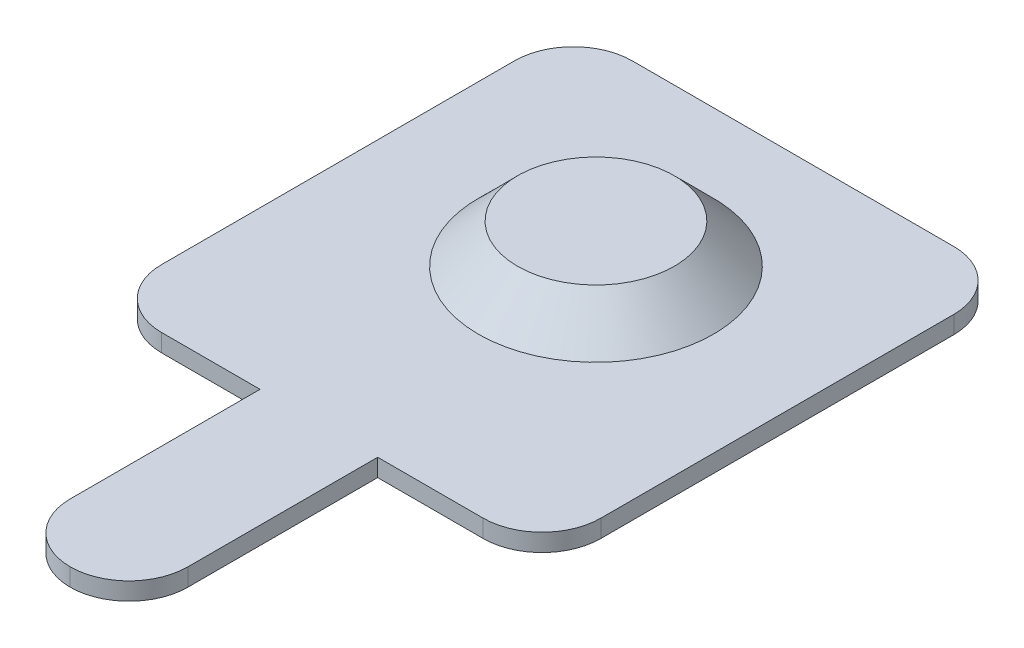
ISO-10303-21;
HEADER;
FILE_DESCRIPTION(('STEP AP214'),'2;1');
FILE_NAME('part.step','',(''),(''),'','','');
FILE_SCHEMA(('AUTOMOTIVE_DESIGN { 1 0 10303 214 1 1 1 1 }'));
ENDSEC;
DATA;
#1=APPLICATION_CONTEXT('core data for automotive mechanical design processes');
#2=APPLICATION_PROTOCOL_DEFINITION('international standard','automotive_design',2000,#1);
#3=PRODUCT_CONTEXT('',#1,'mechanical');
#4=PRODUCT('Part','Part','',(#3));
#5=PRODUCT_RELATED_PRODUCT_CATEGORY('part','',(#4));
#6=PRODUCT_DEFINITION_FORMATION('','',#4);
#7=PRODUCT_DEFINITION_CONTEXT('part definition',#1,'design');
#8=PRODUCT_DEFINITION('design','',#6,#7);
#9=PRODUCT_DEFINITION_SHAPE('','',#8);
#10=(LENGTH_UNIT() NAMED_UNIT(*) SI_UNIT(.MILLI.,.METRE.));
#11=(NAMED_UNIT(*) PLANE_ANGLE_UNIT() SI_UNIT($,.RADIAN.));
#12=(NAMED_UNIT(*) SI_UNIT($,.STERADIAN.) SOLID_ANGLE_UNIT());
#13=UNCERTAINTY_MEASURE_WITH_UNIT(LENGTH_MEASURE(1.E-05),#10,'distance_accuracy_value','');
#14=(GEOMETRIC_REPRESENTATION_CONTEXT(3) GLOBAL_UNCERTAINTY_ASSIGNED_CONTEXT((#13)) GLOBAL_UNIT_ASSIGNED_CONTEXT((#10,
#11,#12)) REPRESENTATION_CONTEXT('',''));
#15=CARTESIAN_POINT('',(0.,0.,0.));
#16=DIRECTION('',(0.,0.,1.));
#17=DIRECTION('',(1.,0.,0.));
#18=AXIS2_PLACEMENT_3D('',#15,#16,#17);
#19=CARTESIAN_POINT('',(0.,0.45,0.));
#20=DIRECTION('',(0.,1.,0.));
#21=DIRECTION('',(0.,0.,1.));
#22=AXIS2_PLACEMENT_3D('',#19,#20,#21);
#23=PLANE('',#22);
#24=CARTESIAN_POINT('',(5.57539399229632,0.45,-7.));
#25=DIRECTION('',(0.,1.,0.));
#26=DIRECTION('',(0.,0.,1.));
#27=AXIS2_PLACEMENT_3D('',#24,#25,#26);
#28=CIRCLE('',#27,3.);
#29=CARTESIAN_POINT('',(5.57539399229632,0.45,-4.));
#30=VERTEX_POINT('',#29);
#31=EDGE_CURVE('E11',#30,#30,#28,.F.);
#32=ORIENTED_EDGE('',*,*,#31,.T.);
#33=EDGE_LOOP('',(#32));
#34=FACE_BOUND('',#33,.T.);
#35=DIRECTION('',(0.,0.,-1.));
#36=VECTOR('',#35,1.);
#37=CARTESIAN_POINT('',(0.,0.45,0.));
#38=LINE('',#37,#36);
#39=CARTESIAN_POINT('',(0.,0.45,-1.5));
#40=VERTEX_POINT('',#39);
#41=CARTESIAN_POINT('',(0.,0.45,-10.5));
#42=VERTEX_POINT('',#41);
#43=EDGE_CURVE('E162',#40,#42,#38,.T.);
#44=ORIENTED_EDGE('',*,*,#43,.F.);
#45=CARTESIAN_POINT('',(1.5,0.45,-1.5));
#46=DIRECTION('',(0.,1.,0.));
#47=DIRECTION('',(0.,0.,1.));
#48=AXIS2_PLACEMENT_3D('',#45,#46,#47);
#49=CIRCLE('',#48,1.5);
#50=CARTESIAN_POINT('',(1.5,0.45,0.));
#51=VERTEX_POINT('',#50);
#52=EDGE_CURVE('E137',#40,#51,#49,.T.);
#53=ORIENTED_EDGE('',*,*,#52,.T.);
#54=DIRECTION('',(1.,0.,0.));
#55=VECTOR('',#54,1.);
#56=CARTESIAN_POINT('',(0.,0.45,0.));
#57=LINE('',#56,#55);
#58=CARTESIAN_POINT('',(4.0097451637429,0.45,0.));
#59=VERTEX_POINT('',#58);
#60=EDGE_CURVE('E131',#51,#59,#57,.T.);
#61=ORIENTED_EDGE('',*,*,#60,.T.);
#62=DIRECTION('',(0.,0.,1.));
#63=VECTOR('',#62,1.);
#64=CARTESIAN_POINT('',(4.0097451637429,0.45,0.));
#65=LINE('',#64,#63);
#66=CARTESIAN_POINT('',(4.0097451637429,0.45,4.84));
#67=VERTEX_POINT('',#66);
#68=EDGE_CURVE('E134',#59,#67,#65,.T.);
#69=ORIENTED_EDGE('',*,*,#68,.T.);
#70=CARTESIAN_POINT('',(5.5097451637429,0.45,4.84));
#71=DIRECTION('',(0.,1.,0.));
#72=DIRECTION('',(0.,0.,1.));
#73=AXIS2_PLACEMENT_3D('',#70,#71,#72);
#74=CIRCLE('',#73,1.5);
#75=CARTESIAN_POINT('',(5.5097451637429,0.45,6.34));
#76=VERTEX_POINT('',#75);
#77=EDGE_CURVE('E182',#67,#76,#74,.T.);
#78=ORIENTED_EDGE('',*,*,#77,.T.);
#79=CARTESIAN_POINT('',(5.5097451637429,0.45,4.84));
#80=DIRECTION('',(0.,1.,0.));
#81=DIRECTION('',(0.,0.,1.));
#82=AXIS2_PLACEMENT_3D('',#79,#80,#81);
#83=CIRCLE('',#82,1.5);
#84=CARTESIAN_POINT('',(7.0097451637429,0.45,4.84));
#85=VERTEX_POINT('',#84);
#86=EDGE_CURVE('E184',#76,#85,#83,.T.);
#87=ORIENTED_EDGE('',*,*,#86,.T.);
#88=DIRECTION('',(0.,0.,1.));
#89=VECTOR('',#88,1.);
#90=CARTESIAN_POINT('',(7.0097451637429,0.45,0.));
#91=LINE('',#90,#89);
#92=CARTESIAN_POINT('',(7.0097451637429,0.45,0.));
#93=VERTEX_POINT('',#92);
#94=EDGE_CURVE('E151',#93,#85,#91,.T.);
#95=ORIENTED_EDGE('',*,*,#94,.F.);
#96=CARTESIAN_POINT('',(9.7,0.45,0.));
#97=VERTEX_POINT('',#96);
#98=EDGE_CURVE('E144',#93,#97,#57,.T.);
#99=ORIENTED_EDGE('',*,*,#98,.T.);
#100=CARTESIAN_POINT('',(9.7,0.45,-1.5));
#101=DIRECTION('',(0.,1.,0.));
#102=DIRECTION('',(0.,0.,1.));
#103=AXIS2_PLACEMENT_3D('',#100,#101,#102);
#104=CIRCLE('',#103,1.5);
#105=CARTESIAN_POINT('',(11.2,0.45,-1.5));
#106=VERTEX_POINT('',#105);
#107=EDGE_CURVE('E186',#97,#106,#104,.T.);
#108=ORIENTED_EDGE('',*,*,#107,.T.);
#109=DIRECTION('',(0.,0.,-1.));
#110=VECTOR('',#109,1.);
#111=CARTESIAN_POINT('',(11.2,0.45,0.));
#112=LINE('',#111,#110);
#113=CARTESIAN_POINT('',(11.2,0.45,-10.5));
#114=VERTEX_POINT('',#113);
#115=EDGE_CURVE('E222',#106,#114,#112,.T.);
#116=ORIENTED_EDGE('',*,*,#115,.T.);
#117=CARTESIAN_POINT('',(9.7,0.45,-10.5));
#118=DIRECTION('',(0.,1.,0.));
#119=DIRECTION('',(0.,0.,1.));
#120=AXIS2_PLACEMENT_3D('',#117,#118,#119);
#121=CIRCLE('',#120,1.5);
#122=CARTESIAN_POINT('',(9.7,0.45,-12.));
#123=VERTEX_POINT('',#122);
#124=EDGE_CURVE('E50',#114,#123,#121,.T.);
#125=ORIENTED_EDGE('',*,*,#124,.T.);
#126=DIRECTION('',(1.,0.,0.));
#127=VECTOR('',#126,1.);
#128=CARTESIAN_POINT('',(0.,0.45,-12.));
#129=LINE('',#128,#127);
#130=CARTESIAN_POINT('',(1.5,0.45,-12.));
#131=VERTEX_POINT('',#130);
#132=EDGE_CURVE('E224',#131,#123,#129,.T.);
#133=ORIENTED_EDGE('',*,*,#132,.F.);
#134=CARTESIAN_POINT('',(1.5,0.45,-10.5));
#135=DIRECTION('',(0.,1.,0.));
#136=DIRECTION('',(0.,0.,1.));
#137=AXIS2_PLACEMENT_3D('',#134,#135,#136);
#138=CIRCLE('',#137,1.5);
#139=EDGE_CURVE('E189',#131,#42,#138,.T.);
#140=ORIENTED_EDGE('',*,*,#139,.T.);
#141=EDGE_LOOP('',(#44,#53,#61,#69,#78,#87,#95,#99,#108,#116,#125,#133,#140));
#142=FACE_BOUND('',#141,.T.);
#143=ADVANCED_FACE('F35',(#34,#142),#23,.T.);
#144=CARTESIAN_POINT('',(0.,0.45,0.));
#145=DIRECTION('',(0.,0.,-1.));
#146=DIRECTION('',(-1.,0.,0.));
#147=AXIS2_PLACEMENT_3D('',#144,#145,#146);
#148=PLANE('',#147);
#149=ORIENTED_EDGE('',*,*,#60,.F.);
#150=DIRECTION('',(0.,-1.,0.));
#151=VECTOR('',#150,1.);
#152=CARTESIAN_POINT('',(1.5,0.,0.));
#153=LINE('',#152,#151);
#154=CARTESIAN_POINT('',(1.5,0.,0.));
#155=VERTEX_POINT('',#154);
#156=EDGE_CURVE('E157',#51,#155,#153,.T.);
#157=ORIENTED_EDGE('',*,*,#156,.T.);
#158=DIRECTION('',(1.,0.,0.));
#159=VECTOR('',#158,1.);
#160=CARTESIAN_POINT('',(0.,0.,0.));
#161=LINE('',#160,#159);
#162=CARTESIAN_POINT('',(4.0097451637429,0.,0.));
#163=VERTEX_POINT('',#162);
#164=EDGE_CURVE('E155',#155,#163,#161,.T.);
#165=ORIENTED_EDGE('',*,*,#164,.T.);
#166=DIRECTION('',(0.,-1.,0.));
#167=VECTOR('',#166,1.);
#168=CARTESIAN_POINT('',(4.0097451637429,0.45,0.));
#169=LINE('',#168,#167);
#170=EDGE_CURVE('E149',#59,#163,#169,.T.);
#171=ORIENTED_EDGE('',*,*,#170,.F.);
#172=EDGE_LOOP('',(#149,#157,#165,#171));
#173=FACE_BOUND('',#172,.T.);
#174=ADVANCED_FACE('F153',(#173),#148,.F.);
#175=CARTESIAN_POINT('',(4.0097451637429,0.45,0.));
#176=DIRECTION('',(1.,0.,0.));
#177=DIRECTION('',(0.,0.,-1.));
#178=AXIS2_PLACEMENT_3D('',#175,#176,#177);
#179=PLANE('',#178);
#180=DIRECTION('',(0.,0.,1.));
#181=VECTOR('',#180,1.);
#182=CARTESIAN_POINT('',(4.0097451637429,0.,0.));
#183=LINE('',#182,#181);
#184=CARTESIAN_POINT('',(4.0097451637429,0.,4.84));
#185=VERTEX_POINT('',#184);
#186=EDGE_CURVE('E212',#163,#185,#183,.T.);
#187=ORIENTED_EDGE('',*,*,#186,.T.);
#188=DIRECTION('',(0.,-1.,0.));
#189=VECTOR('',#188,1.);
#190=CARTESIAN_POINT('',(4.0097451637429,0.45,4.84));
#191=LINE('',#190,#189);
#192=EDGE_CURVE('E43',#185,#67,#191,.F.);
#193=ORIENTED_EDGE('',*,*,#192,.T.);
#194=ORIENTED_EDGE('',*,*,#68,.F.);
#195=ORIENTED_EDGE('',*,*,#170,.T.);
#196=EDGE_LOOP('',(#187,#193,#194,#195));
#197=FACE_BOUND('',#196,.T.);
#198=ADVANCED_FACE('F148',(#197),#179,.F.);
#199=CARTESIAN_POINT('',(7.0097451637429,0.45,0.));
#200=DIRECTION('',(1.,0.,0.));
#201=DIRECTION('',(0.,0.,-1.));
#202=AXIS2_PLACEMENT_3D('',#199,#200,#201);
#203=PLANE('',#202);
#204=ORIENTED_EDGE('',*,*,#94,.T.);
#205=DIRECTION('',(0.,-1.,0.));
#206=VECTOR('',#205,1.);
#207=CARTESIAN_POINT('',(7.0097451637429,0.,4.84));
#208=LINE('',#207,#206);
#209=CARTESIAN_POINT('',(7.0097451637429,0.,4.84));
#210=VERTEX_POINT('',#209);
#211=EDGE_CURVE('E203',#85,#210,#208,.T.);
#212=ORIENTED_EDGE('',*,*,#211,.T.);
#213=DIRECTION('',(0.,0.,1.));
#214=VECTOR('',#213,1.);
#215=CARTESIAN_POINT('',(7.0097451637429,0.,0.));
#216=LINE('',#215,#214);
#217=CARTESIAN_POINT('',(7.0097451637429,0.,0.));
#218=VERTEX_POINT('',#217);
#219=EDGE_CURVE('E229',#218,#210,#216,.T.);
#220=ORIENTED_EDGE('',*,*,#219,.F.);
#221=DIRECTION('',(0.,-1.,0.));
#222=VECTOR('',#221,1.);
#223=CARTESIAN_POINT('',(7.0097451637429,0.45,0.));
#224=LINE('',#223,#222);
#225=EDGE_CURVE('E158',#93,#218,#224,.T.);
#226=ORIENTED_EDGE('',*,*,#225,.F.);
#227=EDGE_LOOP('',(#204,#212,#220,#226));
#228=FACE_BOUND('',#227,.T.);
#229=ADVANCED_FACE('F254',(#228),#203,.T.);
#230=CARTESIAN_POINT('',(9.7,0.,0.));
#231=VERTEX_POINT('',#230);
#232=EDGE_CURVE('E214',#218,#231,#161,.T.);
#233=ORIENTED_EDGE('',*,*,#232,.T.);
#234=DIRECTION('',(0.,-1.,0.));
#235=VECTOR('',#234,1.);
#236=CARTESIAN_POINT('',(9.7,0.45,0.));
#237=LINE('',#236,#235);
#238=EDGE_CURVE('E201',#231,#97,#237,.F.);
#239=ORIENTED_EDGE('',*,*,#238,.T.);
#240=ORIENTED_EDGE('',*,*,#98,.F.);
#241=ORIENTED_EDGE('',*,*,#225,.T.);
#242=EDGE_LOOP('',(#233,#239,#240,#241));
#243=FACE_BOUND('',#242,.T.);
#244=ADVANCED_FACE('F263',(#243),#148,.F.);
#245=CARTESIAN_POINT('',(11.2,0.45,0.));
#246=DIRECTION('',(-1.,0.,0.));
#247=DIRECTION('',(0.,0.,1.));
#248=AXIS2_PLACEMENT_3D('',#245,#246,#247);
#249=PLANE('',#248);
#250=DIRECTION('',(0.,0.,-1.));
#251=VECTOR('',#250,1.);
#252=CARTESIAN_POINT('',(11.2,0.,0.));
#253=LINE('',#252,#251);
#254=CARTESIAN_POINT('',(11.2,0.,-1.5));
#255=VERTEX_POINT('',#254);
#256=CARTESIAN_POINT('',(11.2,0.,-10.5));
#257=VERTEX_POINT('',#256);
#258=EDGE_CURVE('E232',#255,#257,#253,.T.);
#259=ORIENTED_EDGE('',*,*,#258,.T.);
#260=DIRECTION('',(0.,-1.,0.));
#261=VECTOR('',#260,1.);
#262=CARTESIAN_POINT('',(11.2,0.45,-10.5));
#263=LINE('',#262,#261);
#264=EDGE_CURVE('E199',#257,#114,#263,.F.);
#265=ORIENTED_EDGE('',*,*,#264,.T.);
#266=ORIENTED_EDGE('',*,*,#115,.F.);
#267=DIRECTION('',(0.,-1.,0.));
#268=VECTOR('',#267,1.);
#269=CARTESIAN_POINT('',(11.2,0.45,-1.5));
#270=LINE('',#269,#268);
#271=EDGE_CURVE('E196',#106,#255,#270,.T.);
#272=ORIENTED_EDGE('',*,*,#271,.T.);
#273=EDGE_LOOP('',(#259,#265,#266,#272));
#274=FACE_BOUND('',#273,.T.);
#275=ADVANCED_FACE('F270',(#274),#249,.F.);
#276=CARTESIAN_POINT('',(0.,0.45,-12.));
#277=DIRECTION('',(0.,0.,-1.));
#278=DIRECTION('',(-1.,0.,0.));
#279=AXIS2_PLACEMENT_3D('',#276,#277,#278);
#280=PLANE('',#279);
#281=DIRECTION('',(1.,0.,0.));
#282=VECTOR('',#281,1.);
#283=CARTESIAN_POINT('',(0.,0.,-12.));
#284=LINE('',#283,#282);
#285=CARTESIAN_POINT('',(1.5,0.,-12.));
#286=VERTEX_POINT('',#285);
#287=CARTESIAN_POINT('',(9.7,0.,-12.));
#288=VERTEX_POINT('',#287);
#289=EDGE_CURVE('E235',#286,#288,#284,.T.);
#290=ORIENTED_EDGE('',*,*,#289,.F.);
#291=DIRECTION('',(0.,-1.,0.));
#292=VECTOR('',#291,1.);
#293=CARTESIAN_POINT('',(1.5,0.45,-12.));
#294=LINE('',#293,#292);
#295=EDGE_CURVE('E57',#286,#131,#294,.F.);
#296=ORIENTED_EDGE('',*,*,#295,.T.);
#297=ORIENTED_EDGE('',*,*,#132,.T.);
#298=DIRECTION('',(0.,-1.,0.));
#299=VECTOR('',#298,1.);
#300=CARTESIAN_POINT('',(9.7,0.,-12.));
#301=LINE('',#300,#299);
#302=EDGE_CURVE('E192',#123,#288,#301,.T.);
#303=ORIENTED_EDGE('',*,*,#302,.T.);
#304=EDGE_LOOP('',(#290,#296,#297,#303));
#305=FACE_BOUND('',#304,.T.);
#306=ADVANCED_FACE('F275',(#305),#280,.T.);
#307=CARTESIAN_POINT('',(0.,0.45,0.));
#308=DIRECTION('',(-1.,0.,0.));
#309=DIRECTION('',(0.,0.,1.));
#310=AXIS2_PLACEMENT_3D('',#307,#308,#309);
#311=PLANE('',#310);
#312=DIRECTION('',(0.,0.,-1.));
#313=VECTOR('',#312,1.);
#314=CARTESIAN_POINT('',(0.,0.,0.));
#315=LINE('',#314,#313);
#316=CARTESIAN_POINT('',(0.,0.,-1.5));
#317=VERTEX_POINT('',#316);
#318=CARTESIAN_POINT('',(0.,0.,-10.5));
#319=VERTEX_POINT('',#318);
#320=EDGE_CURVE('E142',#317,#319,#315,.T.);
#321=ORIENTED_EDGE('',*,*,#320,.F.);
#322=DIRECTION('',(0.,-1.,0.));
#323=VECTOR('',#322,1.);
#324=CARTESIAN_POINT('',(0.,0.45,-1.5));
#325=LINE('',#324,#323);
#326=EDGE_CURVE('E180',#317,#40,#325,.F.);
#327=ORIENTED_EDGE('',*,*,#326,.T.);
#328=ORIENTED_EDGE('',*,*,#43,.T.);
#329=DIRECTION('',(0.,-1.,0.));
#330=VECTOR('',#329,1.);
#331=CARTESIAN_POINT('',(0.,0.45,-10.5));
#332=LINE('',#331,#330);
#333=EDGE_CURVE('E177',#42,#319,#332,.T.);
#334=ORIENTED_EDGE('',*,*,#333,.T.);
#335=EDGE_LOOP('',(#321,#327,#328,#334));
#336=FACE_BOUND('',#335,.T.);
#337=ADVANCED_FACE('F243',(#336),#311,.T.);
#338=CARTESIAN_POINT('',(0.,0.,0.));
#339=DIRECTION('',(0.,1.,0.));
#340=DIRECTION('',(0.,0.,1.));
#341=AXIS2_PLACEMENT_3D('',#338,#339,#340);
#342=PLANE('',#341);
#343=ORIENTED_EDGE('',*,*,#164,.F.);
#344=CARTESIAN_POINT('',(1.5,0.,-1.5));
#345=DIRECTION('',(0.,1.,0.));
#346=DIRECTION('',(0.,0.,1.));
#347=AXIS2_PLACEMENT_3D('',#344,#345,#346);
#348=CIRCLE('',#347,1.5);
#349=EDGE_CURVE('E175',#155,#317,#348,.F.);
#350=ORIENTED_EDGE('',*,*,#349,.T.);
#351=ORIENTED_EDGE('',*,*,#320,.T.);
#352=CARTESIAN_POINT('',(1.5,0.,-10.5));
#353=DIRECTION('',(0.,1.,0.));
#354=DIRECTION('',(0.,0.,1.));
#355=AXIS2_PLACEMENT_3D('',#352,#353,#354);
#356=CIRCLE('',#355,1.5);
#357=EDGE_CURVE('E173',#319,#286,#356,.F.);
#358=ORIENTED_EDGE('',*,*,#357,.T.);
#359=ORIENTED_EDGE('',*,*,#289,.T.);
#360=CARTESIAN_POINT('',(9.7,0.,-10.5));
#361=DIRECTION('',(0.,1.,0.));
#362=DIRECTION('',(0.,0.,1.));
#363=AXIS2_PLACEMENT_3D('',#360,#361,#362);
#364=CIRCLE('',#363,1.5);
#365=EDGE_CURVE('E171',#288,#257,#364,.F.);
#366=ORIENTED_EDGE('',*,*,#365,.T.);
#367=ORIENTED_EDGE('',*,*,#258,.F.);
#368=CARTESIAN_POINT('',(9.7,0.,-1.5));
#369=DIRECTION('',(0.,1.,0.));
#370=DIRECTION('',(0.,0.,1.));
#371=AXIS2_PLACEMENT_3D('',#368,#369,#370);
#372=CIRCLE('',#371,1.5);
#373=EDGE_CURVE('E169',#255,#231,#372,.F.);
#374=ORIENTED_EDGE('',*,*,#373,.T.);
#375=ORIENTED_EDGE('',*,*,#232,.F.);
#376=ORIENTED_EDGE('',*,*,#219,.T.);
#377=CARTESIAN_POINT('',(5.5097451637429,0.,4.84));
#378=DIRECTION('',(0.,1.,0.));
#379=DIRECTION('',(0.,0.,1.));
#380=AXIS2_PLACEMENT_3D('',#377,#378,#379);
#381=CIRCLE('',#380,1.5);
#382=CARTESIAN_POINT('',(5.5097451637429,0.,6.34));
#383=VERTEX_POINT('',#382);
#384=EDGE_CURVE('E167',#210,#383,#381,.F.);
#385=ORIENTED_EDGE('',*,*,#384,.T.);
#386=CARTESIAN_POINT('',(5.5097451637429,0.,4.84));
#387=DIRECTION('',(0.,1.,0.));
#388=DIRECTION('',(0.,0.,1.));
#389=AXIS2_PLACEMENT_3D('',#386,#387,#388);
#390=CIRCLE('',#389,1.5);
#391=EDGE_CURVE('E160',#383,#185,#390,.F.);
#392=ORIENTED_EDGE('',*,*,#391,.T.);
#393=ORIENTED_EDGE('',*,*,#186,.F.);
#394=EDGE_LOOP('',(#343,#350,#351,#358,#359,#366,#367,#374,#375,#376,#385,#392,#393));
#395=FACE_BOUND('',#394,.T.);
#396=ADVANCED_FACE('F240',(#395),#342,.F.);
#397=CARTESIAN_POINT('',(1.5,0.45,-1.5));
#398=DIRECTION('',(0.,1.,0.));
#399=DIRECTION('',(0.,0.,1.));
#400=AXIS2_PLACEMENT_3D('',#397,#398,#399);
#401=CYLINDRICAL_SURFACE('',#400,1.5);
#402=ORIENTED_EDGE('',*,*,#52,.F.);
#403=ORIENTED_EDGE('',*,*,#326,.F.);
#404=ORIENTED_EDGE('',*,*,#349,.F.);
#405=ORIENTED_EDGE('',*,*,#156,.F.);
#406=EDGE_LOOP('',(#402,#403,#404,#405));
#407=FACE_BOUND('',#406,.T.);
#408=ADVANCED_FACE('F246',(#407),#401,.T.);
#409=CARTESIAN_POINT('',(1.5,0.45,-10.5));
#410=DIRECTION('',(0.,-1.,0.));
#411=DIRECTION('',(0.,0.,-1.));
#412=AXIS2_PLACEMENT_3D('',#409,#410,#411);
#413=CYLINDRICAL_SURFACE('',#412,1.5);
#414=ORIENTED_EDGE('',*,*,#139,.F.);
#415=ORIENTED_EDGE('',*,*,#295,.F.);
#416=ORIENTED_EDGE('',*,*,#357,.F.);
#417=ORIENTED_EDGE('',*,*,#333,.F.);
#418=EDGE_LOOP('',(#414,#415,#416,#417));
#419=FACE_BOUND('',#418,.T.);
#420=ADVANCED_FACE('F278',(#419),#413,.T.);
#421=CARTESIAN_POINT('',(9.7,0.45,-10.5));
#422=DIRECTION('',(0.,1.,0.));
#423=DIRECTION('',(0.,0.,1.));
#424=AXIS2_PLACEMENT_3D('',#421,#422,#423);
#425=CYLINDRICAL_SURFACE('',#424,1.5);
#426=ORIENTED_EDGE('',*,*,#124,.F.);
#427=ORIENTED_EDGE('',*,*,#264,.F.);
#428=ORIENTED_EDGE('',*,*,#365,.F.);
#429=ORIENTED_EDGE('',*,*,#302,.F.);
#430=EDGE_LOOP('',(#426,#427,#428,#429));
#431=FACE_BOUND('',#430,.T.);
#432=ADVANCED_FACE('F273',(#431),#425,.T.);
#433=CARTESIAN_POINT('',(9.7,0.45,-1.5));
#434=DIRECTION('',(0.,-1.,0.));
#435=DIRECTION('',(0.,0.,-1.));
#436=AXIS2_PLACEMENT_3D('',#433,#434,#435);
#437=CYLINDRICAL_SURFACE('',#436,1.5);
#438=ORIENTED_EDGE('',*,*,#107,.F.);
#439=ORIENTED_EDGE('',*,*,#238,.F.);
#440=ORIENTED_EDGE('',*,*,#373,.F.);
#441=ORIENTED_EDGE('',*,*,#271,.F.);
#442=EDGE_LOOP('',(#438,#439,#440,#441));
#443=FACE_BOUND('',#442,.T.);
#444=ADVANCED_FACE('F266',(#443),#437,.T.);
#445=CARTESIAN_POINT('',(5.5097451637429,0.45,4.84));
#446=DIRECTION('',(0.,-1.,0.));
#447=DIRECTION('',(0.,0.,-1.));
#448=AXIS2_PLACEMENT_3D('',#445,#446,#447);
#449=CYLINDRICAL_SURFACE('',#448,1.5);
#450=DIRECTION('',(0.,-1.,0.));
#451=VECTOR('',#450,1.);
#452=CARTESIAN_POINT('',(5.5097451637429,0.45,6.34));
#453=LINE('',#452,#451);
#454=EDGE_CURVE('E206',#76,#383,#453,.T.);
#455=ORIENTED_EDGE('',*,*,#454,.F.);
#456=ORIENTED_EDGE('',*,*,#77,.F.);
#457=ORIENTED_EDGE('',*,*,#192,.F.);
#458=ORIENTED_EDGE('',*,*,#391,.F.);
#459=EDGE_LOOP('',(#455,#456,#457,#458));
#460=FACE_BOUND('',#459,.T.);
#461=ADVANCED_FACE('F249',(#460),#449,.T.);
#462=CARTESIAN_POINT('',(5.5097451637429,0.45,4.84));
#463=DIRECTION('',(0.,1.,0.));
#464=DIRECTION('',(0.,0.,1.));
#465=AXIS2_PLACEMENT_3D('',#462,#463,#464);
#466=CYLINDRICAL_SURFACE('',#465,1.5);
#467=ORIENTED_EDGE('',*,*,#86,.F.);
#468=ORIENTED_EDGE('',*,*,#454,.T.);
#469=ORIENTED_EDGE('',*,*,#384,.F.);
#470=ORIENTED_EDGE('',*,*,#211,.F.);
#471=EDGE_LOOP('',(#467,#468,#469,#470));
#472=FACE_BOUND('',#471,.T.);
#473=ADVANCED_FACE('F257',(#472),#466,.T.);
#474=CARTESIAN_POINT('',(5.57539399229632,1.45,-7.));
#475=DIRECTION('',(0.,1.,0.));
#476=DIRECTION('',(0.,0.,1.));
#477=AXIS2_PLACEMENT_3D('',#474,#475,#476);
#478=PLANE('',#477);
#479=CARTESIAN_POINT('',(5.57539399229632,1.45,-7.));
#480=DIRECTION('',(0.,1.,0.));
#481=DIRECTION('',(0.,0.,1.));
#482=AXIS2_PLACEMENT_3D('',#479,#480,#481);
#483=CIRCLE('',#482,2.);
#484=CARTESIAN_POINT('',(5.57539399229632,1.45,-5.));
#485=VERTEX_POINT('',#484);
#486=EDGE_CURVE('E208',#485,#485,#483,.T.);
#487=ORIENTED_EDGE('',*,*,#486,.T.);
#488=EDGE_LOOP('',(#487));
#489=FACE_BOUND('',#488,.T.);
#490=ADVANCED_FACE('F296',(#489),#478,.T.);
#491=CARTESIAN_POINT('',(5.57539399229632,1.45000000000001,-7.));
#492=DIRECTION('',(0.,-1.,0.));
#493=DIRECTION('',(0.,0.,-1.));
#494=AXIS2_PLACEMENT_3D('',#491,#492,#493);
#495=CONICAL_SURFACE('',#494,2.,0.785398163397443);
#496=ORIENTED_EDGE('',*,*,#31,.F.);
#497=EDGE_LOOP('',(#496));
#498=FACE_BOUND('',#497,.T.);
#499=ORIENTED_EDGE('',*,*,#486,.F.);
#500=EDGE_LOOP('',(#499));
#501=FACE_BOUND('',#500,.T.);
#502=ADVANCED_FACE('F37',(#498,#501),#495,.T.);
#503=CLOSED_SHELL('',(#143,#174,#198,#229,#244,#275,#306,#337,#396,#408,#420,#432,#444,#461,
#473,#490,#502));
#504=MANIFOLD_SOLID_BREP('B2',#503);
#505=ADVANCED_BREP_SHAPE_REPRESENTATION('',(#18,#504),#14);
#506=SHAPE_DEFINITION_REPRESENTATION(#9,#505);
ENDSEC;
END-ISO-10303-21;
